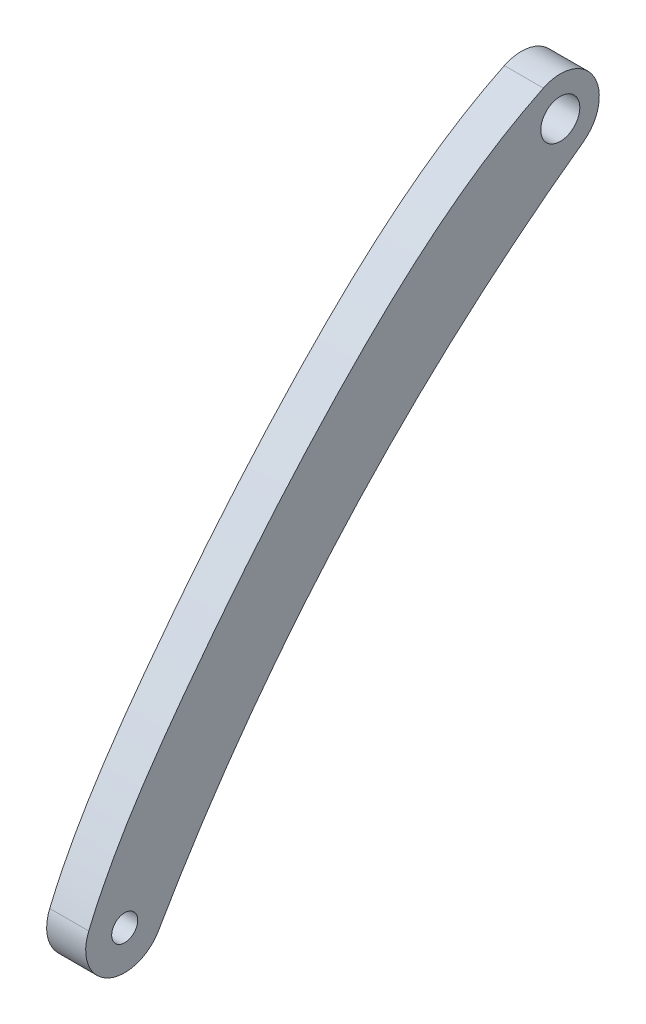
ISO-10303-21;
HEADER;
FILE_DESCRIPTION(('STEP AP214'),'2;1');
FILE_NAME('part.step','',(''),(''),'','','');
FILE_SCHEMA(('AUTOMOTIVE_DESIGN { 1 0 10303 214 1 1 1 1 }'));
ENDSEC;
DATA;
#1=APPLICATION_CONTEXT('core data for automotive mechanical design processes');
#2=APPLICATION_PROTOCOL_DEFINITION('international standard','automotive_design',2000,#1);
#3=PRODUCT_CONTEXT('',#1,'mechanical');
#4=PRODUCT('Part','Part','',(#3));
#5=PRODUCT_RELATED_PRODUCT_CATEGORY('part','',(#4));
#6=PRODUCT_DEFINITION_FORMATION('','',#4);
#7=PRODUCT_DEFINITION_CONTEXT('part definition',#1,'design');
#8=PRODUCT_DEFINITION('design','',#6,#7);
#9=PRODUCT_DEFINITION_SHAPE('','',#8);
#10=(LENGTH_UNIT() NAMED_UNIT(*) SI_UNIT(.MILLI.,.METRE.));
#11=(NAMED_UNIT(*) PLANE_ANGLE_UNIT() SI_UNIT($,.RADIAN.));
#12=(NAMED_UNIT(*) SI_UNIT($,.STERADIAN.) SOLID_ANGLE_UNIT());
#13=UNCERTAINTY_MEASURE_WITH_UNIT(LENGTH_MEASURE(1.E-05),#10,'distance_accuracy_value','');
#14=(GEOMETRIC_REPRESENTATION_CONTEXT(3) GLOBAL_UNCERTAINTY_ASSIGNED_CONTEXT((#13)) GLOBAL_UNIT_ASSIGNED_CONTEXT((#10,
#11,#12)) REPRESENTATION_CONTEXT('',''));
#15=CARTESIAN_POINT('',(0.,0.,0.));
#16=DIRECTION('',(0.,0.,1.));
#17=DIRECTION('',(1.,0.,0.));
#18=AXIS2_PLACEMENT_3D('',#15,#16,#17);
#19=CARTESIAN_POINT('',(4.5,-110.523438239801,-117.054422993068));
#20=DIRECTION('',(1.,0.,0.));
#21=DIRECTION('',(0.,0.,-1.));
#22=AXIS2_PLACEMENT_3D('',#19,#20,#21);
#23=PLANE('',#22);
#24=CARTESIAN_POINT('',(4.5,71.2565794700032,147.909990600819));
#25=DIRECTION('',(1.,0.,0.));
#26=DIRECTION('',(0.,0.,-1.));
#27=AXIS2_PLACEMENT_3D('',#24,#25,#26);
#28=CIRCLE('',#27,2.);
#29=CARTESIAN_POINT('',(4.5,71.2565794700032,145.909990600819));
#30=VERTEX_POINT('',#29);
#31=EDGE_CURVE('E11',#30,#30,#28,.T.);
#32=ORIENTED_EDGE('',*,*,#31,.F.);
#33=EDGE_LOOP('',(#32));
#34=FACE_BOUND('',#33,.T.);
#35=CARTESIAN_POINT('',(4.5,145.494770627488,80.9122968071901));
#36=DIRECTION('',(1.,0.,0.));
#37=DIRECTION('',(0.,0.,-1.));
#38=AXIS2_PLACEMENT_3D('',#35,#36,#37);
#39=CIRCLE('',#38,2.99999999999999);
#40=CARTESIAN_POINT('',(4.5,145.494770627488,77.9122968071901));
#41=VERTEX_POINT('',#40);
#42=EDGE_CURVE('E60',#41,#41,#39,.T.);
#43=ORIENTED_EDGE('',*,*,#42,.F.);
#44=EDGE_LOOP('',(#43));
#45=FACE_BOUND('',#44,.T.);
#46=CARTESIAN_POINT('',(4.5,-46.5978400628803,-57.3104900979379));
#47=DIRECTION('',(-1.,0.,0.));
#48=DIRECTION('',(0.,0.,1.));
#49=AXIS2_PLACEMENT_3D('',#46,#47,#48);
#50=CIRCLE('',#49,230.653987715529);
#51=CARTESIAN_POINT('',(4.5,68.2685608694153,142.70693910746));
#52=VERTEX_POINT('',#51);
#53=CARTESIAN_POINT('',(4.5,140.62455620487,77.4078693963675));
#54=VERTEX_POINT('',#53);
#55=EDGE_CURVE('E99',#52,#54,#50,.T.);
#56=ORIENTED_EDGE('',*,*,#55,.T.);
#57=CARTESIAN_POINT('',(4.5,145.494770627488,80.9122968071901));
#58=DIRECTION('',(-1.,0.,0.));
#59=DIRECTION('',(0.,0.,1.));
#60=AXIS2_PLACEMENT_3D('',#57,#58,#59);
#61=CIRCLE('',#60,5.99999999999999);
#62=CARTESIAN_POINT('',(4.5,150.898316566067,83.5203020390979));
#63=VERTEX_POINT('',#62);
#64=EDGE_CURVE('E230',#63,#54,#61,.T.);
#65=ORIENTED_EDGE('',*,*,#64,.F.);
#66=CARTESIAN_POINT('',(4.5,150.898316566067,83.520302039098));
#67=CARTESIAN_POINT('',(4.5,145.2051898878,95.3159346412858));
#68=CARTESIAN_POINT('',(4.5,127.744788655546,114.843857064359));
#69=CARTESIAN_POINT('',(4.5,100.777949871121,137.161096472397));
#70=CARTESIAN_POINT('',(4.5,82.3898399797121,149.740882267091));
#71=CARTESIAN_POINT('',(4.5,73.5804320209958,153.441691001351));
#72=B_SPLINE_CURVE_WITH_KNOTS('',3,(#66,#67,#68,#69,#70,#71),.UNSPECIFIED.,.F.,.F.,(4,1,1,4),
(0.,0.370027271066106,0.73022315654269,1.),.UNSPECIFIED.);
#73=CARTESIAN_POINT('',(4.5,73.5804320209958,153.441691001351));
#74=VERTEX_POINT('',#73);
#75=EDGE_CURVE('E100',#63,#74,#72,.T.);
#76=ORIENTED_EDGE('',*,*,#75,.T.);
#77=CARTESIAN_POINT('',(4.5,71.2565794700032,147.909990600819));
#78=DIRECTION('',(-1.,0.,0.));
#79=DIRECTION('',(0.,0.,1.));
#80=AXIS2_PLACEMENT_3D('',#77,#78,#79);
#81=CIRCLE('',#80,6.00000000000002);
#82=EDGE_CURVE('E228',#52,#74,#81,.T.);
#83=ORIENTED_EDGE('',*,*,#82,.F.);
#84=EDGE_LOOP('',(#56,#65,#76,#83));
#85=FACE_BOUND('',#84,.T.);
#86=ADVANCED_FACE('F46',(#34,#45,#85),#23,.T.);
#87=CARTESIAN_POINT('',(4.5,71.2565794700032,147.909990600819));
#88=DIRECTION('',(-1.,0.,0.));
#89=DIRECTION('',(0.,0.,1.));
#90=AXIS2_PLACEMENT_3D('',#87,#88,#89);
#91=CYLINDRICAL_SURFACE('',#90,2.);
#92=ORIENTED_EDGE('',*,*,#31,.T.);
#93=EDGE_LOOP('',(#92));
#94=FACE_BOUND('',#93,.T.);
#95=CARTESIAN_POINT('',(-1.5,71.2565794700032,147.909990600819));
#96=DIRECTION('',(1.,0.,0.));
#97=DIRECTION('',(0.,0.,-1.));
#98=AXIS2_PLACEMENT_3D('',#95,#96,#97);
#99=CIRCLE('',#98,2.);
#100=CARTESIAN_POINT('',(-1.5,71.2565794700032,145.909990600819));
#101=VERTEX_POINT('',#100);
#102=EDGE_CURVE('E150',#101,#101,#99,.T.);
#103=ORIENTED_EDGE('',*,*,#102,.F.);
#104=EDGE_LOOP('',(#103));
#105=FACE_BOUND('',#104,.T.);
#106=ADVANCED_FACE('F131',(#94,#105),#91,.F.);
#107=CARTESIAN_POINT('',(4.5,145.494770627488,80.9122968071901));
#108=DIRECTION('',(-1.,0.,0.));
#109=DIRECTION('',(0.,0.,1.));
#110=AXIS2_PLACEMENT_3D('',#107,#108,#109);
#111=CYLINDRICAL_SURFACE('',#110,2.99999999999999);
#112=ORIENTED_EDGE('',*,*,#42,.T.);
#113=EDGE_LOOP('',(#112));
#114=FACE_BOUND('',#113,.T.);
#115=CARTESIAN_POINT('',(-1.5,145.494770627488,80.9122968071901));
#116=DIRECTION('',(1.,0.,0.));
#117=DIRECTION('',(0.,0.,-1.));
#118=AXIS2_PLACEMENT_3D('',#115,#116,#117);
#119=CIRCLE('',#118,2.99999999999999);
#120=CARTESIAN_POINT('',(-1.5,145.494770627488,77.9122968071901));
#121=VERTEX_POINT('',#120);
#122=EDGE_CURVE('E147',#121,#121,#119,.T.);
#123=ORIENTED_EDGE('',*,*,#122,.F.);
#124=EDGE_LOOP('',(#123));
#125=FACE_BOUND('',#124,.T.);
#126=ADVANCED_FACE('F48',(#114,#125),#111,.F.);
#127=CARTESIAN_POINT('',(-1.5,-110.523438239801,-117.054422993068));
#128=DIRECTION('',(1.,0.,0.));
#129=DIRECTION('',(0.,0.,-1.));
#130=AXIS2_PLACEMENT_3D('',#127,#128,#129);
#131=PLANE('',#130);
#132=CARTESIAN_POINT('',(-1.500012,150.898316566067,83.520302039098));
#133=CARTESIAN_POINT('',(-1.500012,145.2051898878,95.3159346412858));
#134=CARTESIAN_POINT('',(-1.500012,127.744788655546,114.843857064359));
#135=CARTESIAN_POINT('',(-1.500012,100.777949871121,137.161096472397));
#136=CARTESIAN_POINT('',(-1.500012,82.3898399797121,149.740882267091));
#137=CARTESIAN_POINT('',(-1.500012,73.5804320209958,153.441691001351));
#138=B_SPLINE_CURVE_WITH_KNOTS('',3,(#132,#133,#134,#135,#136,#137),.UNSPECIFIED.,.F.,.F.,(4,1,
1,4),(0.,0.370027271066106,0.73022315654269,1.),.UNSPECIFIED.);
#139=CARTESIAN_POINT('',(-1.500006,150.898316566067,83.5203020390979));
#140=VERTEX_POINT('',#139);
#141=CARTESIAN_POINT('',(-1.500006,73.5804320209958,153.441691001351));
#142=VERTEX_POINT('',#141);
#143=EDGE_CURVE('E94',#140,#142,#138,.T.);
#144=ORIENTED_EDGE('',*,*,#143,.F.);
#145=CARTESIAN_POINT('',(-1.5,150.898316566067,83.5203020390979));
#146=CARTESIAN_POINT('',(-1.5,151.387529983531,82.5066970268491));
#147=CARTESIAN_POINT('',(-1.5,151.476185799547,81.3841787198088));
#148=CARTESIAN_POINT('',(-1.5,151.564780334778,80.2624363212981));
#149=CARTESIAN_POINT('',(-1.5,151.24042378196,79.1838669334303));
#150=CARTESIAN_POINT('',(-1.5,150.916369616439,78.1063030614956));
#151=CARTESIAN_POINT('',(-1.5,150.223100406433,77.218667494233));
#152=CARTESIAN_POINT('',(-1.5,149.530477509246,76.3318594413572));
#153=CARTESIAN_POINT('',(-1.5,148.56259865876,75.7558996957817));
#154=CARTESIAN_POINT('',(-1.5,147.595622130815,75.180476899083));
#155=CARTESIAN_POINT('',(-1.5,146.484790857695,74.9945387905271));
#156=CARTESIAN_POINT('',(-1.5,145.374995176932,74.8087740261043));
#157=CARTESIAN_POINT('',(-1.5,144.272314023415,75.0381500733096));
#158=CARTESIAN_POINT('',(-1.5,143.170660864185,75.26731228058));
#159=CARTESIAN_POINT('',(-1.5,142.226123739647,75.8808012519289));
#160=CARTESIAN_POINT('',(-1.5,141.282239231701,76.4938663404357));
#161=CARTESIAN_POINT('',(-1.5,140.62455620487,77.4078693963675));
#162=B_SPLINE_CURVE_WITH_KNOTS('',2,(#145,#146,#147,#148,#149,#150,#151,#152,#153,#154,#155,
#156,#157,#158,#159,#160,#161),.UNSPECIFIED.,.F.,.F.,(3,2,2,2,2,2,2,2,3),(0.,0.125,0.25,0.375,
0.5,0.625,0.75,0.875,1.),.UNSPECIFIED.);
#163=CARTESIAN_POINT('',(-1.500006,140.62455620487,77.4078693963675));
#164=VERTEX_POINT('',#163);
#165=EDGE_CURVE('E103',#140,#164,#162,.T.);
#166=ORIENTED_EDGE('',*,*,#165,.T.);
#167=CARTESIAN_POINT('',(-1.500012,-46.5978400628803,-57.3104900979379));
#168=DIRECTION('',(-1.,0.,0.));
#169=DIRECTION('',(0.,0.498003100097984,0.867175248893093));
#170=AXIS2_PLACEMENT_3D('',#167,#168,#169);
#171=CIRCLE('',#170,230.653987715529);
#172=CARTESIAN_POINT('',(-1.500006,68.2685608694153,142.70693910746));
#173=VERTEX_POINT('',#172);
#174=EDGE_CURVE('E148',#173,#164,#171,.T.);
#175=ORIENTED_EDGE('',*,*,#174,.F.);
#176=CARTESIAN_POINT('',(-1.5,68.2685608694153,142.70693910746));
#177=CARTESIAN_POINT('',(-1.5,67.275560686698,143.277201196954));
#178=CARTESIAN_POINT('',(-1.5,66.5620474125617,144.173499096526));
#179=CARTESIAN_POINT('',(-1.5,65.8490186893324,145.069188315116));
#180=CARTESIAN_POINT('',(-1.5,65.5157659520155,146.165553685453));
#181=CARTESIAN_POINT('',(-1.5,65.182818579026,147.260914440266));
#182=CARTESIAN_POINT('',(-1.5,65.2768639540084,148.402943283914));
#183=CARTESIAN_POINT('',(-1.5,65.3708231538371,149.543925669816));
#184=CARTESIAN_POINT('',(-1.5,65.8789402397085,150.57100475125));
#185=CARTESIAN_POINT('',(-1.5,66.3865917304524,151.59714270508));
#186=CARTESIAN_POINT('',(-1.5,67.2373196970549,152.364825151906));
#187=CARTESIAN_POINT('',(-1.5,68.0872681292369,153.13180416013));
#188=CARTESIAN_POINT('',(-1.5,69.1609618623991,153.532124256532));
#189=CARTESIAN_POINT('',(-1.5,70.2336717543319,153.932077533789));
#190=CARTESIAN_POINT('',(-1.5,71.3793285667679,153.908734857681));
#191=CARTESIAN_POINT('',(-1.5,72.5242076709385,153.885408027324));
#192=CARTESIAN_POINT('',(-1.5,73.5804320209958,153.441691001351));
#193=B_SPLINE_CURVE_WITH_KNOTS('',2,(#176,#177,#178,#179,#180,#181,#182,#183,#184,#185,#186,
#187,#188,#189,#190,#191,#192),.UNSPECIFIED.,.F.,.F.,(3,2,2,2,2,2,2,2,3),(0.,0.125,0.25,0.375,
0.5,0.625,0.75,0.875,1.),.UNSPECIFIED.);
#194=EDGE_CURVE('E75',#173,#142,#193,.T.);
#195=ORIENTED_EDGE('',*,*,#194,.T.);
#196=EDGE_LOOP('',(#144,#166,#175,#195));
#197=FACE_BOUND('',#196,.T.);
#198=ORIENTED_EDGE('',*,*,#122,.T.);
#199=EDGE_LOOP('',(#198));
#200=FACE_BOUND('',#199,.T.);
#201=ORIENTED_EDGE('',*,*,#102,.T.);
#202=EDGE_LOOP('',(#201));
#203=FACE_BOUND('',#202,.T.);
#204=ADVANCED_FACE('F111',(#197,#200,#203),#131,.F.);
#205=CARTESIAN_POINT('',(4.5,145.494770627488,80.9122968071901));
#206=DIRECTION('',(-1.,0.,0.));
#207=DIRECTION('',(0.,0.,1.));
#208=AXIS2_PLACEMENT_3D('',#205,#206,#207);
#209=CYLINDRICAL_SURFACE('',#208,5.99999999999999);
#210=DIRECTION('',(-1.,0.,0.));
#211=VECTOR('',#210,1.);
#212=CARTESIAN_POINT('',(4.5,150.898316566067,83.5203020390979));
#213=LINE('',#212,#211);
#214=EDGE_CURVE('E89',#63,#140,#213,.T.);
#215=ORIENTED_EDGE('',*,*,#214,.F.);
#216=ORIENTED_EDGE('',*,*,#64,.T.);
#217=DIRECTION('',(-1.,0.,0.));
#218=VECTOR('',#217,1.);
#219=CARTESIAN_POINT('',(4.5,140.62455620487,77.4078693963675));
#220=LINE('',#219,#218);
#221=EDGE_CURVE('E110',#54,#164,#220,.T.);
#222=ORIENTED_EDGE('',*,*,#221,.T.);
#223=ORIENTED_EDGE('',*,*,#165,.F.);
#224=EDGE_LOOP('',(#215,#216,#222,#223));
#225=FACE_BOUND('',#224,.T.);
#226=ADVANCED_FACE('F104',(#225),#209,.T.);
#227=CARTESIAN_POINT('',(4.5,-46.5978400628803,-57.3104900979379));
#228=DIRECTION('',(-1.,0.,0.));
#229=DIRECTION('',(0.,0.,1.));
#230=AXIS2_PLACEMENT_3D('',#227,#228,#229);
#231=CYLINDRICAL_SURFACE('',#230,230.653987715529);
#232=ORIENTED_EDGE('',*,*,#221,.F.);
#233=ORIENTED_EDGE('',*,*,#55,.F.);
#234=DIRECTION('',(-1.,0.,0.));
#235=VECTOR('',#234,1.);
#236=CARTESIAN_POINT('',(4.5,68.2685608694153,142.70693910746));
#237=LINE('',#236,#235);
#238=EDGE_CURVE('E182',#52,#173,#237,.T.);
#239=ORIENTED_EDGE('',*,*,#238,.T.);
#240=ORIENTED_EDGE('',*,*,#174,.T.);
#241=EDGE_LOOP('',(#232,#233,#239,#240));
#242=FACE_BOUND('',#241,.T.);
#243=ADVANCED_FACE('F159',(#242),#231,.F.);
#244=CARTESIAN_POINT('',(4.5,71.2565794700032,147.909990600819));
#245=DIRECTION('',(-1.,0.,0.));
#246=DIRECTION('',(0.,0.,1.));
#247=AXIS2_PLACEMENT_3D('',#244,#245,#246);
#248=CYLINDRICAL_SURFACE('',#247,6.00000000000002);
#249=ORIENTED_EDGE('',*,*,#238,.F.);
#250=ORIENTED_EDGE('',*,*,#82,.T.);
#251=DIRECTION('',(-1.,0.,0.));
#252=VECTOR('',#251,1.);
#253=CARTESIAN_POINT('',(4.5,73.5804320209958,153.441691001351));
#254=LINE('',#253,#252);
#255=EDGE_CURVE('E62',#74,#142,#254,.T.);
#256=ORIENTED_EDGE('',*,*,#255,.T.);
#257=ORIENTED_EDGE('',*,*,#194,.F.);
#258=EDGE_LOOP('',(#249,#250,#256,#257));
#259=FACE_BOUND('',#258,.T.);
#260=ADVANCED_FACE('F166',(#259),#248,.T.);
#261=DIRECTION('',(-1.,0.,0.));
#262=VECTOR('',#261,1.);
#263=SURFACE_OF_LINEAR_EXTRUSION('',#72,#262);
#264=ORIENTED_EDGE('',*,*,#255,.F.);
#265=ORIENTED_EDGE('',*,*,#75,.F.);
#266=ORIENTED_EDGE('',*,*,#214,.T.);
#267=ORIENTED_EDGE('',*,*,#143,.T.);
#268=EDGE_LOOP('',(#264,#265,#266,#267));
#269=FACE_BOUND('',#268,.T.);
#270=ADVANCED_FACE('F95',(#269),#263,.F.);
#271=CLOSED_SHELL('',(#86,#106,#126,#204,#226,#243,#260,#270));
#272=MANIFOLD_SOLID_BREP('B2',#271);
#273=ADVANCED_BREP_SHAPE_REPRESENTATION('',(#18,#272),#14);
#274=SHAPE_DEFINITION_REPRESENTATION(#9,#273);
ENDSEC;
END-ISO-10303-21;
